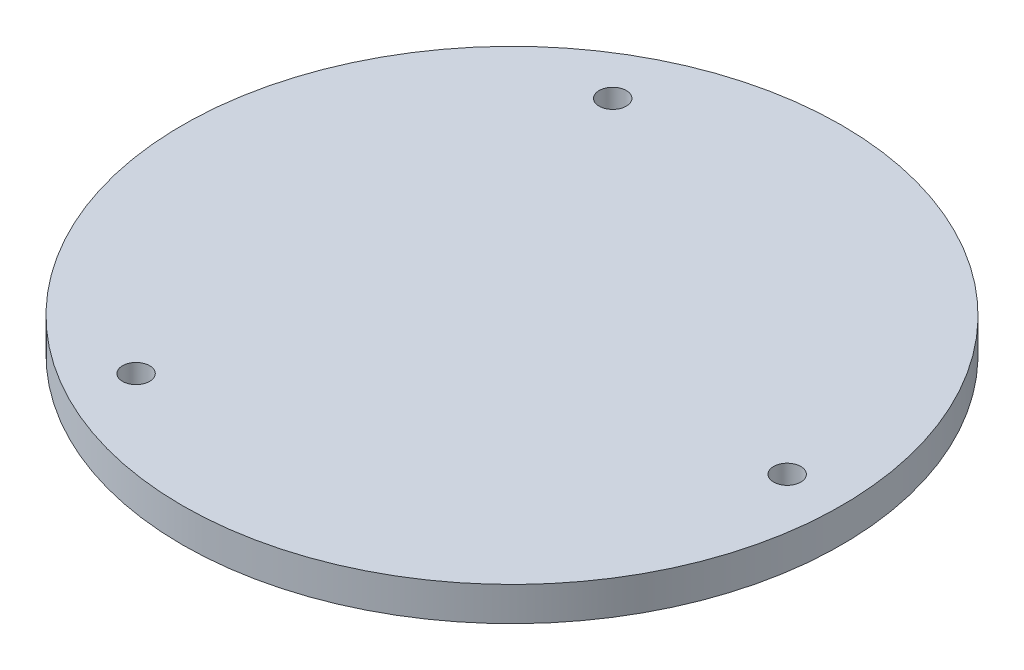
ISO-10303-21;
HEADER;
FILE_DESCRIPTION(('STEP AP214'),'2;1');
FILE_NAME('part.step','',(''),(''),'','','');
FILE_SCHEMA(('AUTOMOTIVE_DESIGN { 1 0 10303 214 1 1 1 1 }'));
ENDSEC;
DATA;
#1=APPLICATION_CONTEXT('core data for automotive mechanical design processes');
#2=APPLICATION_PROTOCOL_DEFINITION('international standard','automotive_design',2000,#1);
#3=PRODUCT_CONTEXT('',#1,'mechanical');
#4=PRODUCT('Part','Part','',(#3));
#5=PRODUCT_RELATED_PRODUCT_CATEGORY('part','',(#4));
#6=PRODUCT_DEFINITION_FORMATION('','',#4);
#7=PRODUCT_DEFINITION_CONTEXT('part definition',#1,'design');
#8=PRODUCT_DEFINITION('design','',#6,#7);
#9=PRODUCT_DEFINITION_SHAPE('','',#8);
#10=(LENGTH_UNIT() NAMED_UNIT(*) SI_UNIT(.MILLI.,.METRE.));
#11=(NAMED_UNIT(*) PLANE_ANGLE_UNIT() SI_UNIT($,.RADIAN.));
#12=(NAMED_UNIT(*) SI_UNIT($,.STERADIAN.) SOLID_ANGLE_UNIT());
#13=UNCERTAINTY_MEASURE_WITH_UNIT(LENGTH_MEASURE(1.E-05),#10,'distance_accuracy_value','');
#14=(GEOMETRIC_REPRESENTATION_CONTEXT(3) GLOBAL_UNCERTAINTY_ASSIGNED_CONTEXT((#13)) GLOBAL_UNIT_ASSIGNED_CONTEXT((#10,
#11,#12)) REPRESENTATION_CONTEXT('',''));
#15=CARTESIAN_POINT('',(0.,0.,0.));
#16=DIRECTION('',(0.,0.,1.));
#17=DIRECTION('',(1.,0.,0.));
#18=AXIS2_PLACEMENT_3D('',#15,#16,#17);
#19=CARTESIAN_POINT('',(-20.25,-16.,35.0740288532697));
#20=DIRECTION('',(0.,1.,0.));
#21=DIRECTION('',(0.,0.,1.));
#22=AXIS2_PLACEMENT_3D('',#19,#20,#21);
#23=CYLINDRICAL_SURFACE('',#22,2.);
#24=CARTESIAN_POINT('',(-20.25,-16.,35.0740288532697));
#25=DIRECTION('',(0.,-1.,0.));
#26=DIRECTION('',(0.,0.,-1.));
#27=AXIS2_PLACEMENT_3D('',#24,#25,#26);
#28=CIRCLE('',#27,2.);
#29=CARTESIAN_POINT('',(-20.25,-16.,33.0740288532697));
#30=VERTEX_POINT('',#29);
#31=EDGE_CURVE('E22',#30,#30,#28,.T.);
#32=ORIENTED_EDGE('',*,*,#31,.T.);
#33=EDGE_LOOP('',(#32));
#34=FACE_BOUND('',#33,.T.);
#35=CARTESIAN_POINT('',(-20.25,-11.,35.0740288532697));
#36=DIRECTION('',(0.,-1.,0.));
#37=DIRECTION('',(0.,0.,-1.));
#38=AXIS2_PLACEMENT_3D('',#35,#36,#37);
#39=CIRCLE('',#38,2.);
#40=CARTESIAN_POINT('',(-20.25,-11.,33.0740288532697));
#41=VERTEX_POINT('',#40);
#42=EDGE_CURVE('E43',#41,#41,#39,.T.);
#43=ORIENTED_EDGE('',*,*,#42,.F.);
#44=EDGE_LOOP('',(#43));
#45=FACE_BOUND('',#44,.T.);
#46=ADVANCED_FACE('F13',(#34,#45),#23,.F.);
#47=CARTESIAN_POINT('',(-20.25,-16.,-35.0740288532697));
#48=DIRECTION('',(0.,1.,0.));
#49=DIRECTION('',(0.,0.,1.));
#50=AXIS2_PLACEMENT_3D('',#47,#48,#49);
#51=CYLINDRICAL_SURFACE('',#50,2.);
#52=CARTESIAN_POINT('',(-20.25,-16.,-35.0740288532697));
#53=DIRECTION('',(0.,-1.,0.));
#54=DIRECTION('',(0.,0.,-1.));
#55=AXIS2_PLACEMENT_3D('',#52,#53,#54);
#56=CIRCLE('',#55,2.);
#57=CARTESIAN_POINT('',(-20.25,-16.,-37.0740288532698));
#58=VERTEX_POINT('',#57);
#59=EDGE_CURVE('E32',#58,#58,#56,.T.);
#60=ORIENTED_EDGE('',*,*,#59,.T.);
#61=EDGE_LOOP('',(#60));
#62=FACE_BOUND('',#61,.T.);
#63=CARTESIAN_POINT('',(-20.25,-11.,-35.0740288532697));
#64=DIRECTION('',(0.,-1.,0.));
#65=DIRECTION('',(0.,0.,-1.));
#66=AXIS2_PLACEMENT_3D('',#63,#64,#65);
#67=CIRCLE('',#66,2.);
#68=CARTESIAN_POINT('',(-20.25,-11.,-37.0740288532698));
#69=VERTEX_POINT('',#68);
#70=EDGE_CURVE('E40',#69,#69,#67,.T.);
#71=ORIENTED_EDGE('',*,*,#70,.F.);
#72=EDGE_LOOP('',(#71));
#73=FACE_BOUND('',#72,.T.);
#74=ADVANCED_FACE('F65',(#62,#73),#51,.F.);
#75=CARTESIAN_POINT('',(40.5,-16.,0.));
#76=DIRECTION('',(0.,1.,0.));
#77=DIRECTION('',(0.,0.,1.));
#78=AXIS2_PLACEMENT_3D('',#75,#76,#77);
#79=CYLINDRICAL_SURFACE('',#78,2.);
#80=CARTESIAN_POINT('',(40.5,-16.,0.));
#81=DIRECTION('',(0.,-1.,0.));
#82=DIRECTION('',(0.,0.,-1.));
#83=AXIS2_PLACEMENT_3D('',#80,#81,#82);
#84=CIRCLE('',#83,2.);
#85=CARTESIAN_POINT('',(40.5,-16.,-2.00000000000003));
#86=VERTEX_POINT('',#85);
#87=EDGE_CURVE('E49',#86,#86,#84,.T.);
#88=ORIENTED_EDGE('',*,*,#87,.T.);
#89=EDGE_LOOP('',(#88));
#90=FACE_BOUND('',#89,.T.);
#91=CARTESIAN_POINT('',(40.5,-11.,0.));
#92=DIRECTION('',(0.,-1.,0.));
#93=DIRECTION('',(0.,0.,-1.));
#94=AXIS2_PLACEMENT_3D('',#91,#92,#93);
#95=CIRCLE('',#94,2.);
#96=CARTESIAN_POINT('',(40.5,-11.,-2.00000000000003));
#97=VERTEX_POINT('',#96);
#98=EDGE_CURVE('E36',#97,#97,#95,.T.);
#99=ORIENTED_EDGE('',*,*,#98,.F.);
#100=EDGE_LOOP('',(#99));
#101=FACE_BOUND('',#100,.T.);
#102=ADVANCED_FACE('F15',(#90,#101),#79,.F.);
#103=CARTESIAN_POINT('',(0.,-16.,0.));
#104=DIRECTION('',(0.,1.,0.));
#105=DIRECTION('',(0.,0.,1.));
#106=AXIS2_PLACEMENT_3D('',#103,#104,#105);
#107=CYLINDRICAL_SURFACE('',#106,48.5);
#108=CARTESIAN_POINT('',(0.,-16.,0.));
#109=DIRECTION('',(0.,-1.,0.));
#110=DIRECTION('',(0.,0.,-1.));
#111=AXIS2_PLACEMENT_3D('',#108,#109,#110);
#112=CIRCLE('',#111,48.5);
#113=CARTESIAN_POINT('',(0.,-16.,-48.5));
#114=VERTEX_POINT('',#113);
#115=EDGE_CURVE('E9',#114,#114,#112,.T.);
#116=ORIENTED_EDGE('',*,*,#115,.F.);
#117=EDGE_LOOP('',(#116));
#118=FACE_BOUND('',#117,.T.);
#119=CARTESIAN_POINT('',(0.,-11.,0.));
#120=DIRECTION('',(0.,-1.,0.));
#121=DIRECTION('',(0.,0.,-1.));
#122=AXIS2_PLACEMENT_3D('',#119,#120,#121);
#123=CIRCLE('',#122,48.5);
#124=CARTESIAN_POINT('',(0.,-11.,-48.5));
#125=VERTEX_POINT('',#124);
#126=EDGE_CURVE('E17',#125,#125,#123,.T.);
#127=ORIENTED_EDGE('',*,*,#126,.T.);
#128=EDGE_LOOP('',(#127));
#129=FACE_BOUND('',#128,.T.);
#130=ADVANCED_FACE('F72',(#118,#129),#107,.T.);
#131=CARTESIAN_POINT('',(0.,-16.,0.));
#132=DIRECTION('',(0.,-1.,0.));
#133=DIRECTION('',(1.,0.,0.));
#134=AXIS2_PLACEMENT_3D('',#131,#132,#133);
#135=PLANE('',#134);
#136=ORIENTED_EDGE('',*,*,#87,.F.);
#137=EDGE_LOOP('',(#136));
#138=FACE_BOUND('',#137,.T.);
#139=ORIENTED_EDGE('',*,*,#59,.F.);
#140=EDGE_LOOP('',(#139));
#141=FACE_BOUND('',#140,.T.);
#142=ORIENTED_EDGE('',*,*,#31,.F.);
#143=EDGE_LOOP('',(#142));
#144=FACE_BOUND('',#143,.T.);
#145=ORIENTED_EDGE('',*,*,#115,.T.);
#146=EDGE_LOOP('',(#145));
#147=FACE_BOUND('',#146,.T.);
#148=ADVANCED_FACE('F68',(#138,#141,#144,#147),#135,.T.);
#149=CARTESIAN_POINT('',(0.,-11.,0.));
#150=DIRECTION('',(0.,-1.,0.));
#151=DIRECTION('',(1.,0.,0.));
#152=AXIS2_PLACEMENT_3D('',#149,#150,#151);
#153=PLANE('',#152);
#154=ORIENTED_EDGE('',*,*,#98,.T.);
#155=EDGE_LOOP('',(#154));
#156=FACE_BOUND('',#155,.T.);
#157=ORIENTED_EDGE('',*,*,#70,.T.);
#158=EDGE_LOOP('',(#157));
#159=FACE_BOUND('',#158,.T.);
#160=ORIENTED_EDGE('',*,*,#42,.T.);
#161=EDGE_LOOP('',(#160));
#162=FACE_BOUND('',#161,.T.);
#163=ORIENTED_EDGE('',*,*,#126,.F.);
#164=EDGE_LOOP('',(#163));
#165=FACE_BOUND('',#164,.T.);
#166=ADVANCED_FACE('F71',(#156,#159,#162,#165),#153,.F.);
#167=CLOSED_SHELL('',(#46,#74,#102,#130,#148,#166));
#168=MANIFOLD_SOLID_BREP('B1',#167);
#169=ADVANCED_BREP_SHAPE_REPRESENTATION('',(#18,#168),#14);
#170=SHAPE_DEFINITION_REPRESENTATION(#9,#169);
ENDSEC;
END-ISO-10303-21;
